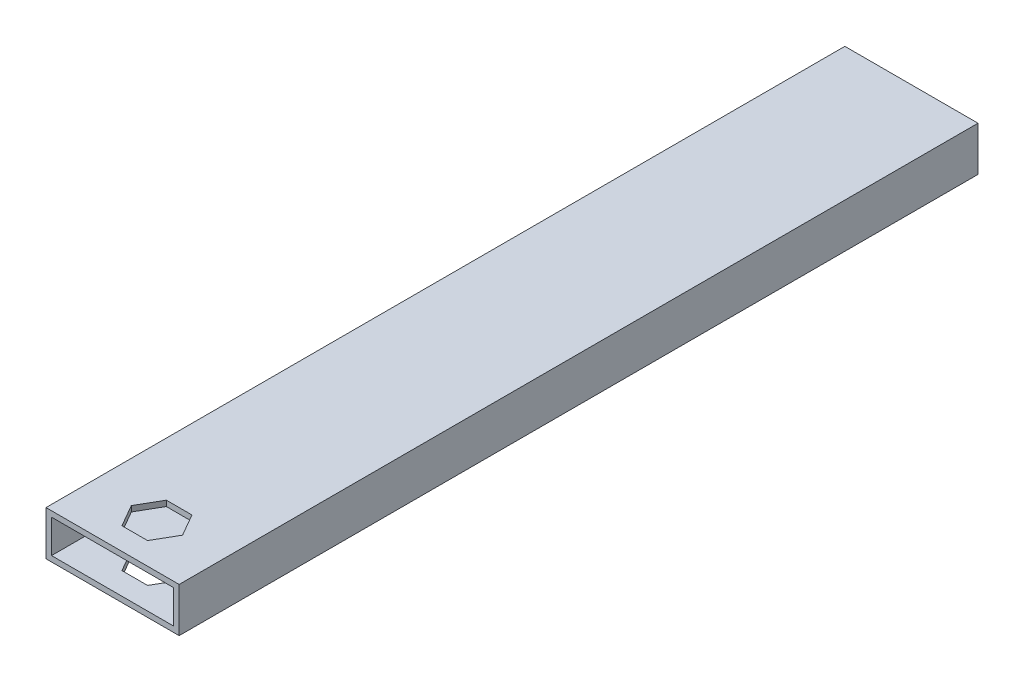
ISO-10303-21;
HEADER;
FILE_DESCRIPTION(('STEP AP214'),'2;1');
FILE_NAME('part.step','',(''),(''),'','','');
FILE_SCHEMA(('AUTOMOTIVE_DESIGN { 1 0 10303 214 1 1 1 1 }'));
ENDSEC;
DATA;
#1=APPLICATION_CONTEXT('core data for automotive mechanical design processes');
#2=APPLICATION_PROTOCOL_DEFINITION('international standard','automotive_design',2000,#1);
#3=PRODUCT_CONTEXT('',#1,'mechanical');
#4=PRODUCT('Part','Part','',(#3));
#5=PRODUCT_RELATED_PRODUCT_CATEGORY('part','',(#4));
#6=PRODUCT_DEFINITION_FORMATION('','',#4);
#7=PRODUCT_DEFINITION_CONTEXT('part definition',#1,'design');
#8=PRODUCT_DEFINITION('design','',#6,#7);
#9=PRODUCT_DEFINITION_SHAPE('','',#8);
#10=(LENGTH_UNIT() NAMED_UNIT(*) SI_UNIT(.MILLI.,.METRE.));
#11=(NAMED_UNIT(*) PLANE_ANGLE_UNIT() SI_UNIT($,.RADIAN.));
#12=(NAMED_UNIT(*) SI_UNIT($,.STERADIAN.) SOLID_ANGLE_UNIT());
#13=UNCERTAINTY_MEASURE_WITH_UNIT(LENGTH_MEASURE(1.E-05),#10,'distance_accuracy_value','');
#14=(GEOMETRIC_REPRESENTATION_CONTEXT(3) GLOBAL_UNCERTAINTY_ASSIGNED_CONTEXT((#13)) GLOBAL_UNIT_ASSIGNED_CONTEXT((#10,
#11,#12)) REPRESENTATION_CONTEXT('',''));
#15=CARTESIAN_POINT('',(0.,0.,0.));
#16=DIRECTION('',(0.,0.,1.));
#17=DIRECTION('',(1.,0.,0.));
#18=AXIS2_PLACEMENT_3D('',#15,#16,#17);
#19=CARTESIAN_POINT('',(0.,0.,228.6));
#20=DIRECTION('',(1.,0.,0.));
#21=DIRECTION('',(0.,0.,-1.));
#22=AXIS2_PLACEMENT_3D('',#19,#20,#21);
#23=PLANE('',#22);
#24=DIRECTION('',(0.,-1.,0.));
#25=VECTOR('',#24,1.);
#26=CARTESIAN_POINT('',(0.,0.,0.));
#27=LINE('',#26,#25);
#28=CARTESIAN_POINT('',(0.,12.7,0.));
#29=VERTEX_POINT('',#28);
#30=CARTESIAN_POINT('',(0.,0.,0.));
#31=VERTEX_POINT('',#30);
#32=EDGE_CURVE('E278',#29,#31,#27,.T.);
#33=ORIENTED_EDGE('',*,*,#32,.T.);
#34=DIRECTION('',(0.,0.,-1.));
#35=VECTOR('',#34,1.);
#36=CARTESIAN_POINT('',(0.,0.,228.6));
#37=LINE('',#36,#35);
#38=CARTESIAN_POINT('',(0.,0.,228.6));
#39=VERTEX_POINT('',#38);
#40=EDGE_CURVE('E311',#39,#31,#37,.T.);
#41=ORIENTED_EDGE('',*,*,#40,.F.);
#42=DIRECTION('',(0.,-1.,0.));
#43=VECTOR('',#42,1.);
#44=CARTESIAN_POINT('',(0.,0.,228.6));
#45=LINE('',#44,#43);
#46=CARTESIAN_POINT('',(0.,12.7,228.6));
#47=VERTEX_POINT('',#46);
#48=EDGE_CURVE('E285',#47,#39,#45,.T.);
#49=ORIENTED_EDGE('',*,*,#48,.F.);
#50=DIRECTION('',(0.,0.,-1.));
#51=VECTOR('',#50,1.);
#52=CARTESIAN_POINT('',(0.,12.7,228.6));
#53=LINE('',#52,#51);
#54=EDGE_CURVE('E295',#47,#29,#53,.T.);
#55=ORIENTED_EDGE('',*,*,#54,.T.);
#56=EDGE_LOOP('',(#33,#41,#49,#55));
#57=FACE_BOUND('',#56,.T.);
#58=ADVANCED_FACE('F33',(#57),#23,.F.);
#59=CARTESIAN_POINT('',(0.,0.,228.6));
#60=DIRECTION('',(0.,1.,0.));
#61=DIRECTION('',(0.,0.,1.));
#62=AXIS2_PLACEMENT_3D('',#59,#60,#61);
#63=PLANE('',#62);
#64=DIRECTION('',(-0.5,0.,0.866025403784439));
#65=VECTOR('',#64,1.);
#66=CARTESIAN_POINT('',(26.3823484187083,0.,215.9));
#67=LINE('',#66,#65);
#68=CARTESIAN_POINT('',(26.3823484187083,0.,215.9));
#69=VERTEX_POINT('',#68);
#70=CARTESIAN_POINT('',(22.7161742093541,0.,222.25));
#71=VERTEX_POINT('',#70);
#72=EDGE_CURVE('E210',#69,#71,#67,.T.);
#73=ORIENTED_EDGE('',*,*,#72,.F.);
#74=DIRECTION('',(0.499999999999999,0.,0.866025403784439));
#75=VECTOR('',#74,1.);
#76=CARTESIAN_POINT('',(22.7161742093542,0.,209.55));
#77=LINE('',#76,#75);
#78=CARTESIAN_POINT('',(22.7161742093542,0.,209.55));
#79=VERTEX_POINT('',#78);
#80=EDGE_CURVE('E47',#79,#69,#77,.T.);
#81=ORIENTED_EDGE('',*,*,#80,.F.);
#82=DIRECTION('',(1.,0.,0.));
#83=VECTOR('',#82,1.);
#84=CARTESIAN_POINT('',(15.3838257906459,0.,209.55));
#85=LINE('',#84,#83);
#86=CARTESIAN_POINT('',(15.3838257906459,0.,209.55));
#87=VERTEX_POINT('',#86);
#88=EDGE_CURVE('E196',#87,#79,#85,.T.);
#89=ORIENTED_EDGE('',*,*,#88,.F.);
#90=DIRECTION('',(0.5,0.,-0.866025403784439));
#91=VECTOR('',#90,1.);
#92=CARTESIAN_POINT('',(11.7176515812918,0.,215.9));
#93=LINE('',#92,#91);
#94=CARTESIAN_POINT('',(11.7176515812918,0.,215.9));
#95=VERTEX_POINT('',#94);
#96=EDGE_CURVE('E199',#95,#87,#93,.T.);
#97=ORIENTED_EDGE('',*,*,#96,.F.);
#98=DIRECTION('',(-0.5,0.,-0.866025403784439));
#99=VECTOR('',#98,1.);
#100=CARTESIAN_POINT('',(15.3838257906459,0.,222.25));
#101=LINE('',#100,#99);
#102=CARTESIAN_POINT('',(15.3838257906459,0.,222.25));
#103=VERTEX_POINT('',#102);
#104=EDGE_CURVE('E216',#103,#95,#101,.T.);
#105=ORIENTED_EDGE('',*,*,#104,.F.);
#106=DIRECTION('',(-1.,0.,0.));
#107=VECTOR('',#106,1.);
#108=CARTESIAN_POINT('',(22.7161742093541,0.,222.25));
#109=LINE('',#108,#107);
#110=EDGE_CURVE('E213',#71,#103,#109,.T.);
#111=ORIENTED_EDGE('',*,*,#110,.F.);
#112=EDGE_LOOP('',(#73,#81,#89,#97,#105,#111));
#113=FACE_BOUND('',#112,.T.);
#114=DIRECTION('',(1.,0.,0.));
#115=VECTOR('',#114,1.);
#116=CARTESIAN_POINT('',(0.,0.,0.));
#117=LINE('',#116,#115);
#118=CARTESIAN_POINT('',(38.1,0.,0.));
#119=VERTEX_POINT('',#118);
#120=EDGE_CURVE('E298',#31,#119,#117,.T.);
#121=ORIENTED_EDGE('',*,*,#120,.T.);
#122=DIRECTION('',(0.,0.,-1.));
#123=VECTOR('',#122,1.);
#124=CARTESIAN_POINT('',(38.1,0.,228.6));
#125=LINE('',#124,#123);
#126=CARTESIAN_POINT('',(38.1,0.,228.6));
#127=VERTEX_POINT('',#126);
#128=EDGE_CURVE('E308',#127,#119,#125,.T.);
#129=ORIENTED_EDGE('',*,*,#128,.F.);
#130=DIRECTION('',(1.,0.,0.));
#131=VECTOR('',#130,1.);
#132=CARTESIAN_POINT('',(0.,0.,228.6));
#133=LINE('',#132,#131);
#134=EDGE_CURVE('E288',#39,#127,#133,.T.);
#135=ORIENTED_EDGE('',*,*,#134,.F.);
#136=ORIENTED_EDGE('',*,*,#40,.T.);
#137=EDGE_LOOP('',(#121,#129,#135,#136));
#138=FACE_BOUND('',#137,.T.);
#139=ADVANCED_FACE('F341',(#113,#138),#63,.F.);
#140=CARTESIAN_POINT('',(38.1,0.,228.6));
#141=DIRECTION('',(-1.,0.,0.));
#142=DIRECTION('',(0.,0.,1.));
#143=AXIS2_PLACEMENT_3D('',#140,#141,#142);
#144=PLANE('',#143);
#145=DIRECTION('',(0.,1.,0.));
#146=VECTOR('',#145,1.);
#147=CARTESIAN_POINT('',(38.1,0.,0.));
#148=LINE('',#147,#146);
#149=CARTESIAN_POINT('',(38.1,12.7,0.));
#150=VERTEX_POINT('',#149);
#151=EDGE_CURVE('E300',#119,#150,#148,.T.);
#152=ORIENTED_EDGE('',*,*,#151,.T.);
#153=DIRECTION('',(0.,0.,-1.));
#154=VECTOR('',#153,1.);
#155=CARTESIAN_POINT('',(38.1,12.7,228.6));
#156=LINE('',#155,#154);
#157=CARTESIAN_POINT('',(38.1,12.7,228.6));
#158=VERTEX_POINT('',#157);
#159=EDGE_CURVE('E305',#158,#150,#156,.T.);
#160=ORIENTED_EDGE('',*,*,#159,.F.);
#161=DIRECTION('',(0.,1.,0.));
#162=VECTOR('',#161,1.);
#163=CARTESIAN_POINT('',(38.1,0.,228.6));
#164=LINE('',#163,#162);
#165=EDGE_CURVE('E291',#127,#158,#164,.T.);
#166=ORIENTED_EDGE('',*,*,#165,.F.);
#167=ORIENTED_EDGE('',*,*,#128,.T.);
#168=EDGE_LOOP('',(#152,#160,#166,#167));
#169=FACE_BOUND('',#168,.T.);
#170=ADVANCED_FACE('F363',(#169),#144,.F.);
#171=CARTESIAN_POINT('',(0.,12.7,228.6));
#172=DIRECTION('',(0.,-1.,0.));
#173=DIRECTION('',(0.,0.,-1.));
#174=AXIS2_PLACEMENT_3D('',#171,#172,#173);
#175=PLANE('',#174);
#176=DIRECTION('',(1.,0.,0.));
#177=VECTOR('',#176,1.);
#178=CARTESIAN_POINT('',(15.3838257906459,12.7,209.55));
#179=LINE('',#178,#177);
#180=CARTESIAN_POINT('',(15.3838257906459,12.7,209.55));
#181=VERTEX_POINT('',#180);
#182=CARTESIAN_POINT('',(22.7161742093542,12.7,209.55));
#183=VERTEX_POINT('',#182);
#184=EDGE_CURVE('E195',#181,#183,#179,.T.);
#185=ORIENTED_EDGE('',*,*,#184,.T.);
#186=DIRECTION('',(0.499999999999999,0.,0.866025403784439));
#187=VECTOR('',#186,1.);
#188=CARTESIAN_POINT('',(22.7161742093542,12.7,209.55));
#189=LINE('',#188,#187);
#190=CARTESIAN_POINT('',(26.3823484187083,12.7,215.9));
#191=VERTEX_POINT('',#190);
#192=EDGE_CURVE('E176',#183,#191,#189,.T.);
#193=ORIENTED_EDGE('',*,*,#192,.T.);
#194=DIRECTION('',(-0.5,0.,0.866025403784439));
#195=VECTOR('',#194,1.);
#196=CARTESIAN_POINT('',(26.3823484187083,12.7,215.9));
#197=LINE('',#196,#195);
#198=CARTESIAN_POINT('',(22.7161742093541,12.7,222.25));
#199=VERTEX_POINT('',#198);
#200=EDGE_CURVE('E186',#191,#199,#197,.T.);
#201=ORIENTED_EDGE('',*,*,#200,.T.);
#202=DIRECTION('',(-1.,0.,0.));
#203=VECTOR('',#202,1.);
#204=CARTESIAN_POINT('',(22.7161742093541,12.7,222.25));
#205=LINE('',#204,#203);
#206=CARTESIAN_POINT('',(15.3838257906459,12.7,222.25));
#207=VERTEX_POINT('',#206);
#208=EDGE_CURVE('E55',#199,#207,#205,.T.);
#209=ORIENTED_EDGE('',*,*,#208,.T.);
#210=DIRECTION('',(-0.5,0.,-0.866025403784439));
#211=VECTOR('',#210,1.);
#212=CARTESIAN_POINT('',(15.3838257906459,12.7,222.25));
#213=LINE('',#212,#211);
#214=CARTESIAN_POINT('',(11.7176515812918,12.7,215.9));
#215=VERTEX_POINT('',#214);
#216=EDGE_CURVE('E203',#207,#215,#213,.T.);
#217=ORIENTED_EDGE('',*,*,#216,.T.);
#218=DIRECTION('',(0.5,0.,-0.866025403784439));
#219=VECTOR('',#218,1.);
#220=CARTESIAN_POINT('',(11.7176515812918,12.7,215.9));
#221=LINE('',#220,#219);
#222=EDGE_CURVE('E206',#215,#181,#221,.T.);
#223=ORIENTED_EDGE('',*,*,#222,.T.);
#224=EDGE_LOOP('',(#185,#193,#201,#209,#217,#223));
#225=FACE_BOUND('',#224,.T.);
#226=DIRECTION('',(-1.,0.,0.));
#227=VECTOR('',#226,1.);
#228=CARTESIAN_POINT('',(0.,12.7,0.));
#229=LINE('',#228,#227);
#230=EDGE_CURVE('E289',#150,#29,#229,.T.);
#231=ORIENTED_EDGE('',*,*,#230,.T.);
#232=ORIENTED_EDGE('',*,*,#54,.F.);
#233=DIRECTION('',(-1.,0.,0.));
#234=VECTOR('',#233,1.);
#235=CARTESIAN_POINT('',(0.,12.7,228.6));
#236=LINE('',#235,#234);
#237=EDGE_CURVE('E293',#158,#47,#236,.T.);
#238=ORIENTED_EDGE('',*,*,#237,.F.);
#239=ORIENTED_EDGE('',*,*,#159,.T.);
#240=EDGE_LOOP('',(#231,#232,#238,#239));
#241=FACE_BOUND('',#240,.T.);
#242=ADVANCED_FACE('F191',(#225,#241),#175,.F.);
#243=CARTESIAN_POINT('',(0.,0.,228.6));
#244=DIRECTION('',(0.,0.,-1.));
#245=DIRECTION('',(-1.,0.,0.));
#246=AXIS2_PLACEMENT_3D('',#243,#244,#245);
#247=PLANE('',#246);
#248=DIRECTION('',(0.,-1.,0.));
#249=VECTOR('',#248,1.);
#250=CARTESIAN_POINT('',(1.5875,11.1125,228.6));
#251=LINE('',#250,#249);
#252=CARTESIAN_POINT('',(1.5875,11.1125,228.6));
#253=VERTEX_POINT('',#252);
#254=CARTESIAN_POINT('',(1.5875,1.5875,228.6));
#255=VERTEX_POINT('',#254);
#256=EDGE_CURVE('E268',#253,#255,#251,.T.);
#257=ORIENTED_EDGE('',*,*,#256,.F.);
#258=DIRECTION('',(-1.,0.,0.));
#259=VECTOR('',#258,1.);
#260=CARTESIAN_POINT('',(36.5125,11.1125,228.6));
#261=LINE('',#260,#259);
#262=CARTESIAN_POINT('',(36.5125,11.1125,228.6));
#263=VERTEX_POINT('',#262);
#264=EDGE_CURVE('E252',#263,#253,#261,.T.);
#265=ORIENTED_EDGE('',*,*,#264,.F.);
#266=DIRECTION('',(0.,1.,0.));
#267=VECTOR('',#266,1.);
#268=CARTESIAN_POINT('',(36.5125,1.5875,228.6));
#269=LINE('',#268,#267);
#270=CARTESIAN_POINT('',(36.5125,1.5875,228.6));
#271=VERTEX_POINT('',#270);
#272=EDGE_CURVE('E257',#271,#263,#269,.T.);
#273=ORIENTED_EDGE('',*,*,#272,.F.);
#274=DIRECTION('',(1.,0.,0.));
#275=VECTOR('',#274,1.);
#276=CARTESIAN_POINT('',(1.5875,1.5875,228.6));
#277=LINE('',#276,#275);
#278=EDGE_CURVE('E271',#255,#271,#277,.T.);
#279=ORIENTED_EDGE('',*,*,#278,.F.);
#280=EDGE_LOOP('',(#257,#265,#273,#279));
#281=FACE_BOUND('',#280,.T.);
#282=ORIENTED_EDGE('',*,*,#48,.T.);
#283=ORIENTED_EDGE('',*,*,#134,.T.);
#284=ORIENTED_EDGE('',*,*,#165,.T.);
#285=ORIENTED_EDGE('',*,*,#237,.T.);
#286=EDGE_LOOP('',(#282,#283,#284,#285));
#287=FACE_BOUND('',#286,.T.);
#288=ADVANCED_FACE('F375',(#281,#287),#247,.F.);
#289=CARTESIAN_POINT('',(0.,0.,0.));
#290=DIRECTION('',(0.,0.,-1.));
#291=DIRECTION('',(-1.,0.,0.));
#292=AXIS2_PLACEMENT_3D('',#289,#290,#291);
#293=PLANE('',#292);
#294=DIRECTION('',(-1.,0.,0.));
#295=VECTOR('',#294,1.);
#296=CARTESIAN_POINT('',(36.5125,11.1125,0.));
#297=LINE('',#296,#295);
#298=CARTESIAN_POINT('',(36.5125,11.1125,0.));
#299=VERTEX_POINT('',#298);
#300=CARTESIAN_POINT('',(1.5875,11.1125,0.));
#301=VERTEX_POINT('',#300);
#302=EDGE_CURVE('E253',#299,#301,#297,.T.);
#303=ORIENTED_EDGE('',*,*,#302,.T.);
#304=DIRECTION('',(0.,-1.,0.));
#305=VECTOR('',#304,1.);
#306=CARTESIAN_POINT('',(1.5875,11.1125,0.));
#307=LINE('',#306,#305);
#308=CARTESIAN_POINT('',(1.5875,1.5875,0.));
#309=VERTEX_POINT('',#308);
#310=EDGE_CURVE('E256',#301,#309,#307,.T.);
#311=ORIENTED_EDGE('',*,*,#310,.T.);
#312=DIRECTION('',(1.,0.,0.));
#313=VECTOR('',#312,1.);
#314=CARTESIAN_POINT('',(1.5875,1.5875,0.));
#315=LINE('',#314,#313);
#316=CARTESIAN_POINT('',(36.5125,1.5875,0.));
#317=VERTEX_POINT('',#316);
#318=EDGE_CURVE('E260',#309,#317,#315,.T.);
#319=ORIENTED_EDGE('',*,*,#318,.T.);
#320=DIRECTION('',(0.,1.,0.));
#321=VECTOR('',#320,1.);
#322=CARTESIAN_POINT('',(36.5125,1.5875,0.));
#323=LINE('',#322,#321);
#324=EDGE_CURVE('E263',#317,#299,#323,.T.);
#325=ORIENTED_EDGE('',*,*,#324,.T.);
#326=EDGE_LOOP('',(#303,#311,#319,#325));
#327=FACE_BOUND('',#326,.T.);
#328=ORIENTED_EDGE('',*,*,#32,.F.);
#329=ORIENTED_EDGE('',*,*,#230,.F.);
#330=ORIENTED_EDGE('',*,*,#151,.F.);
#331=ORIENTED_EDGE('',*,*,#120,.F.);
#332=EDGE_LOOP('',(#328,#329,#330,#331));
#333=FACE_BOUND('',#332,.T.);
#334=ADVANCED_FACE('F370',(#327,#333),#293,.T.);
#335=CARTESIAN_POINT('',(36.5125,11.1125,0.));
#336=DIRECTION('',(0.,1.,0.));
#337=DIRECTION('',(0.,0.,1.));
#338=AXIS2_PLACEMENT_3D('',#335,#336,#337);
#339=PLANE('',#338);
#340=DIRECTION('',(0.5,0.,-0.866025403784439));
#341=VECTOR('',#340,1.);
#342=CARTESIAN_POINT('',(122.402328652561,11.1125,49.5885156932071));
#343=LINE('',#342,#341);
#344=CARTESIAN_POINT('',(22.7161742093541,11.1125,222.25));
#345=VERTEX_POINT('',#344);
#346=CARTESIAN_POINT('',(26.3823484187082,11.1125,215.9));
#347=VERTEX_POINT('',#346);
#348=EDGE_CURVE('E223',#345,#347,#343,.T.);
#349=ORIENTED_EDGE('',*,*,#348,.T.);
#350=DIRECTION('',(-0.5,0.,-0.866025403784439));
#351=VECTOR('',#350,1.);
#352=CARTESIAN_POINT('',(-64.5725560244989,11.1125,58.3614843067928));
#353=LINE('',#352,#351);
#354=CARTESIAN_POINT('',(22.7161742093542,11.1125,209.55));
#355=VERTEX_POINT('',#354);
#356=EDGE_CURVE('E179',#347,#355,#353,.T.);
#357=ORIENTED_EDGE('',*,*,#356,.T.);
#358=DIRECTION('',(-1.,0.,0.));
#359=VECTOR('',#358,1.);
#360=CARTESIAN_POINT('',(36.5125,11.1125,209.55));
#361=LINE('',#360,#359);
#362=CARTESIAN_POINT('',(15.3838257906459,11.1125,209.55));
#363=VERTEX_POINT('',#362);
#364=EDGE_CURVE('E248',#355,#363,#361,.T.);
#365=ORIENTED_EDGE('',*,*,#364,.T.);
#366=DIRECTION('',(-0.5,0.,0.866025403784439));
#367=VECTOR('',#366,1.);
#368=CARTESIAN_POINT('',(111.403806024499,11.1125,43.2385156932072));
#369=LINE('',#368,#367);
#370=CARTESIAN_POINT('',(11.7176515812918,11.1125,215.9));
#371=VERTEX_POINT('',#370);
#372=EDGE_CURVE('E245',#363,#371,#369,.T.);
#373=ORIENTED_EDGE('',*,*,#372,.T.);
#374=DIRECTION('',(0.5,0.,0.866025403784439));
#375=VECTOR('',#374,1.);
#376=CARTESIAN_POINT('',(-75.5710786525613,11.1125,64.7114843067928));
#377=LINE('',#376,#375);
#378=CARTESIAN_POINT('',(15.3838257906459,11.1125,222.25));
#379=VERTEX_POINT('',#378);
#380=EDGE_CURVE('E242',#371,#379,#377,.T.);
#381=ORIENTED_EDGE('',*,*,#380,.T.);
#382=DIRECTION('',(1.,0.,0.));
#383=VECTOR('',#382,1.);
#384=CARTESIAN_POINT('',(36.5125,11.1125,222.25));
#385=LINE('',#384,#383);
#386=EDGE_CURVE('E239',#379,#345,#385,.T.);
#387=ORIENTED_EDGE('',*,*,#386,.T.);
#388=EDGE_LOOP('',(#349,#357,#365,#373,#381,#387));
#389=FACE_BOUND('',#388,.T.);
#390=ORIENTED_EDGE('',*,*,#264,.T.);
#391=DIRECTION('',(0.,0.,1.));
#392=VECTOR('',#391,1.);
#393=CARTESIAN_POINT('',(1.5875,11.1125,0.));
#394=LINE('',#393,#392);
#395=EDGE_CURVE('E266',#301,#253,#394,.T.);
#396=ORIENTED_EDGE('',*,*,#395,.F.);
#397=ORIENTED_EDGE('',*,*,#302,.F.);
#398=DIRECTION('',(0.,0.,1.));
#399=VECTOR('',#398,1.);
#400=CARTESIAN_POINT('',(36.5125,11.1125,0.));
#401=LINE('',#400,#399);
#402=EDGE_CURVE('E276',#299,#263,#401,.T.);
#403=ORIENTED_EDGE('',*,*,#402,.T.);
#404=EDGE_LOOP('',(#390,#396,#397,#403));
#405=FACE_BOUND('',#404,.T.);
#406=ADVANCED_FACE('F388',(#389,#405),#339,.F.);
#407=CARTESIAN_POINT('',(36.5125,1.5875,0.));
#408=DIRECTION('',(1.,0.,0.));
#409=DIRECTION('',(0.,0.,-1.));
#410=AXIS2_PLACEMENT_3D('',#407,#408,#409);
#411=PLANE('',#410);
#412=ORIENTED_EDGE('',*,*,#272,.T.);
#413=ORIENTED_EDGE('',*,*,#402,.F.);
#414=ORIENTED_EDGE('',*,*,#324,.F.);
#415=DIRECTION('',(0.,0.,1.));
#416=VECTOR('',#415,1.);
#417=CARTESIAN_POINT('',(36.5125,1.5875,0.));
#418=LINE('',#417,#416);
#419=EDGE_CURVE('E279',#317,#271,#418,.T.);
#420=ORIENTED_EDGE('',*,*,#419,.T.);
#421=EDGE_LOOP('',(#412,#413,#414,#420));
#422=FACE_BOUND('',#421,.T.);
#423=ADVANCED_FACE('F395',(#422),#411,.F.);
#424=CARTESIAN_POINT('',(1.5875,1.5875,0.));
#425=DIRECTION('',(0.,-1.,0.));
#426=DIRECTION('',(0.,0.,-1.));
#427=AXIS2_PLACEMENT_3D('',#424,#425,#426);
#428=PLANE('',#427);
#429=DIRECTION('',(1.,0.,0.));
#430=VECTOR('',#429,1.);
#431=CARTESIAN_POINT('',(1.5875,1.5875,209.55));
#432=LINE('',#431,#430);
#433=CARTESIAN_POINT('',(15.3838257906459,1.5875,209.55));
#434=VERTEX_POINT('',#433);
#435=CARTESIAN_POINT('',(22.7161742093542,1.5875,209.55));
#436=VERTEX_POINT('',#435);
#437=EDGE_CURVE('E40',#434,#436,#432,.T.);
#438=ORIENTED_EDGE('',*,*,#437,.T.);
#439=DIRECTION('',(0.5,0.,0.866025403784439));
#440=VECTOR('',#439,1.);
#441=CARTESIAN_POINT('',(-73.3038060244989,1.5875,43.238515693207));
#442=LINE('',#441,#440);
#443=CARTESIAN_POINT('',(26.3823484187083,1.5875,215.9));
#444=VERTEX_POINT('',#443);
#445=EDGE_CURVE('E11',#436,#444,#442,.T.);
#446=ORIENTED_EDGE('',*,*,#445,.T.);
#447=DIRECTION('',(-0.5,0.,0.866025403784439));
#448=VECTOR('',#447,1.);
#449=CARTESIAN_POINT('',(113.671078652561,1.5875,64.7114843067928));
#450=LINE('',#449,#448);
#451=CARTESIAN_POINT('',(22.7161742093541,1.5875,222.25));
#452=VERTEX_POINT('',#451);
#453=EDGE_CURVE('E314',#444,#452,#450,.T.);
#454=ORIENTED_EDGE('',*,*,#453,.T.);
#455=DIRECTION('',(-1.,0.,0.));
#456=VECTOR('',#455,1.);
#457=CARTESIAN_POINT('',(1.5875,1.5875,222.25));
#458=LINE('',#457,#456);
#459=CARTESIAN_POINT('',(15.3838257906459,1.5875,222.25));
#460=VERTEX_POINT('',#459);
#461=EDGE_CURVE('E317',#452,#460,#458,.T.);
#462=ORIENTED_EDGE('',*,*,#461,.T.);
#463=DIRECTION('',(-0.5,0.,-0.866025403784439));
#464=VECTOR('',#463,1.);
#465=CARTESIAN_POINT('',(-84.3023286525613,1.5875,49.5885156932071));
#466=LINE('',#465,#464);
#467=CARTESIAN_POINT('',(11.7176515812918,1.5875,215.9));
#468=VERTEX_POINT('',#467);
#469=EDGE_CURVE('E320',#460,#468,#466,.T.);
#470=ORIENTED_EDGE('',*,*,#469,.T.);
#471=DIRECTION('',(0.5,0.,-0.866025403784439));
#472=VECTOR('',#471,1.);
#473=CARTESIAN_POINT('',(102.672556024499,1.5875,58.3614843067929));
#474=LINE('',#473,#472);
#475=EDGE_CURVE('E323',#468,#434,#474,.T.);
#476=ORIENTED_EDGE('',*,*,#475,.T.);
#477=EDGE_LOOP('',(#438,#446,#454,#462,#470,#476));
#478=FACE_BOUND('',#477,.T.);
#479=ORIENTED_EDGE('',*,*,#278,.T.);
#480=ORIENTED_EDGE('',*,*,#419,.F.);
#481=ORIENTED_EDGE('',*,*,#318,.F.);
#482=DIRECTION('',(0.,0.,1.));
#483=VECTOR('',#482,1.);
#484=CARTESIAN_POINT('',(1.5875,1.5875,0.));
#485=LINE('',#484,#483);
#486=EDGE_CURVE('E281',#309,#255,#485,.T.);
#487=ORIENTED_EDGE('',*,*,#486,.T.);
#488=EDGE_LOOP('',(#479,#480,#481,#487));
#489=FACE_BOUND('',#488,.T.);
#490=ADVANCED_FACE('F327',(#478,#489),#428,.F.);
#491=CARTESIAN_POINT('',(1.5875,11.1125,0.));
#492=DIRECTION('',(-1.,0.,0.));
#493=DIRECTION('',(0.,0.,1.));
#494=AXIS2_PLACEMENT_3D('',#491,#492,#493);
#495=PLANE('',#494);
#496=ORIENTED_EDGE('',*,*,#256,.T.);
#497=ORIENTED_EDGE('',*,*,#486,.F.);
#498=ORIENTED_EDGE('',*,*,#310,.F.);
#499=ORIENTED_EDGE('',*,*,#395,.T.);
#500=EDGE_LOOP('',(#496,#497,#498,#499));
#501=FACE_BOUND('',#500,.T.);
#502=ADVANCED_FACE('F397',(#501),#495,.F.);
#503=CARTESIAN_POINT('',(26.3823484187083,12.7,215.9));
#504=DIRECTION('',(0.866025403784439,0.,0.5));
#505=DIRECTION('',(0.5,0.,-0.866025403784439));
#506=AXIS2_PLACEMENT_3D('',#503,#504,#505);
#507=PLANE('',#506);
#508=DIRECTION('',(0.,-1.,0.));
#509=VECTOR('',#508,1.);
#510=CARTESIAN_POINT('',(26.3823484187083,12.7,215.9));
#511=LINE('',#510,#509);
#512=EDGE_CURVE('E183',#444,#69,#511,.T.);
#513=ORIENTED_EDGE('',*,*,#512,.T.);
#514=ORIENTED_EDGE('',*,*,#72,.T.);
#515=DIRECTION('',(0.,-1.,0.));
#516=VECTOR('',#515,1.);
#517=CARTESIAN_POINT('',(22.7161742093541,12.7,222.25));
#518=LINE('',#517,#516);
#519=EDGE_CURVE('E182',#452,#71,#518,.T.);
#520=ORIENTED_EDGE('',*,*,#519,.F.);
#521=ORIENTED_EDGE('',*,*,#453,.F.);
#522=EDGE_LOOP('',(#513,#514,#520,#521));
#523=FACE_BOUND('',#522,.T.);
#524=ADVANCED_FACE('F345',(#523),#507,.F.);
#525=CARTESIAN_POINT('',(22.7161742093541,12.7,222.25));
#526=DIRECTION('',(0.,0.,1.));
#527=DIRECTION('',(1.,0.,0.));
#528=AXIS2_PLACEMENT_3D('',#525,#526,#527);
#529=PLANE('',#528);
#530=ORIENTED_EDGE('',*,*,#519,.T.);
#531=ORIENTED_EDGE('',*,*,#110,.T.);
#532=DIRECTION('',(0.,-1.,0.));
#533=VECTOR('',#532,1.);
#534=CARTESIAN_POINT('',(15.3838257906459,12.7,222.25));
#535=LINE('',#534,#533);
#536=EDGE_CURVE('E236',#460,#103,#535,.T.);
#537=ORIENTED_EDGE('',*,*,#536,.F.);
#538=ORIENTED_EDGE('',*,*,#461,.F.);
#539=EDGE_LOOP('',(#530,#531,#537,#538));
#540=FACE_BOUND('',#539,.T.);
#541=ADVANCED_FACE('F433',(#540),#529,.F.);
#542=CARTESIAN_POINT('',(15.3838257906459,12.7,222.25));
#543=DIRECTION('',(-0.866025403784439,0.,0.5));
#544=DIRECTION('',(0.5,0.,0.866025403784439));
#545=AXIS2_PLACEMENT_3D('',#542,#543,#544);
#546=PLANE('',#545);
#547=ORIENTED_EDGE('',*,*,#536,.T.);
#548=ORIENTED_EDGE('',*,*,#104,.T.);
#549=DIRECTION('',(0.,-1.,0.));
#550=VECTOR('',#549,1.);
#551=CARTESIAN_POINT('',(11.7176515812918,12.7,215.9));
#552=LINE('',#551,#550);
#553=EDGE_CURVE('E232',#468,#95,#552,.T.);
#554=ORIENTED_EDGE('',*,*,#553,.F.);
#555=ORIENTED_EDGE('',*,*,#469,.F.);
#556=EDGE_LOOP('',(#547,#548,#554,#555));
#557=FACE_BOUND('',#556,.T.);
#558=ADVANCED_FACE('F439',(#557),#546,.F.);
#559=CARTESIAN_POINT('',(11.7176515812918,12.7,215.9));
#560=DIRECTION('',(-0.866025403784438,0.,-0.5));
#561=DIRECTION('',(-0.5,0.,0.866025403784439));
#562=AXIS2_PLACEMENT_3D('',#559,#560,#561);
#563=PLANE('',#562);
#564=ORIENTED_EDGE('',*,*,#553,.T.);
#565=ORIENTED_EDGE('',*,*,#96,.T.);
#566=DIRECTION('',(0.,-1.,0.));
#567=VECTOR('',#566,1.);
#568=CARTESIAN_POINT('',(15.3838257906459,12.7,209.55));
#569=LINE('',#568,#567);
#570=EDGE_CURVE('E228',#434,#87,#569,.T.);
#571=ORIENTED_EDGE('',*,*,#570,.F.);
#572=ORIENTED_EDGE('',*,*,#475,.F.);
#573=EDGE_LOOP('',(#564,#565,#571,#572));
#574=FACE_BOUND('',#573,.T.);
#575=ADVANCED_FACE('F334',(#574),#563,.F.);
#576=CARTESIAN_POINT('',(15.3838257906459,12.7,209.55));
#577=DIRECTION('',(0.,0.,-1.));
#578=DIRECTION('',(-1.,0.,0.));
#579=AXIS2_PLACEMENT_3D('',#576,#577,#578);
#580=PLANE('',#579);
#581=ORIENTED_EDGE('',*,*,#570,.T.);
#582=ORIENTED_EDGE('',*,*,#88,.T.);
#583=DIRECTION('',(0.,-1.,0.));
#584=VECTOR('',#583,1.);
#585=CARTESIAN_POINT('',(22.7161742093542,12.7,209.55));
#586=LINE('',#585,#584);
#587=EDGE_CURVE('E224',#436,#79,#586,.T.);
#588=ORIENTED_EDGE('',*,*,#587,.F.);
#589=ORIENTED_EDGE('',*,*,#437,.F.);
#590=EDGE_LOOP('',(#581,#582,#588,#589));
#591=FACE_BOUND('',#590,.T.);
#592=ADVANCED_FACE('F332',(#591),#580,.F.);
#593=CARTESIAN_POINT('',(22.7161742093542,12.7,209.55));
#594=DIRECTION('',(0.866025403784439,0.,-0.499999999999999));
#595=DIRECTION('',(-0.5,0.,-0.866025403784439));
#596=AXIS2_PLACEMENT_3D('',#593,#594,#595);
#597=PLANE('',#596);
#598=ORIENTED_EDGE('',*,*,#587,.T.);
#599=ORIENTED_EDGE('',*,*,#80,.T.);
#600=ORIENTED_EDGE('',*,*,#512,.F.);
#601=ORIENTED_EDGE('',*,*,#445,.F.);
#602=EDGE_LOOP('',(#598,#599,#600,#601));
#603=FACE_BOUND('',#602,.T.);
#604=ADVANCED_FACE('F347',(#603),#597,.F.);
#605=EDGE_CURVE('E171',#191,#347,#511,.T.);
#606=ORIENTED_EDGE('',*,*,#605,.F.);
#607=ORIENTED_EDGE('',*,*,#192,.F.);
#608=EDGE_CURVE('E221',#183,#355,#586,.T.);
#609=ORIENTED_EDGE('',*,*,#608,.T.);
#610=ORIENTED_EDGE('',*,*,#356,.F.);
#611=EDGE_LOOP('',(#606,#607,#609,#610));
#612=FACE_BOUND('',#611,.T.);
#613=ADVANCED_FACE('F173',(#612),#597,.F.);
#614=ORIENTED_EDGE('',*,*,#608,.F.);
#615=ORIENTED_EDGE('',*,*,#184,.F.);
#616=EDGE_CURVE('E225',#181,#363,#569,.T.);
#617=ORIENTED_EDGE('',*,*,#616,.T.);
#618=ORIENTED_EDGE('',*,*,#364,.F.);
#619=EDGE_LOOP('',(#614,#615,#617,#618));
#620=FACE_BOUND('',#619,.T.);
#621=ADVANCED_FACE('F354',(#620),#580,.F.);
#622=ORIENTED_EDGE('',*,*,#616,.F.);
#623=ORIENTED_EDGE('',*,*,#222,.F.);
#624=EDGE_CURVE('E229',#215,#371,#552,.T.);
#625=ORIENTED_EDGE('',*,*,#624,.T.);
#626=ORIENTED_EDGE('',*,*,#372,.F.);
#627=EDGE_LOOP('',(#622,#623,#625,#626));
#628=FACE_BOUND('',#627,.T.);
#629=ADVANCED_FACE('F456',(#628),#563,.F.);
#630=ORIENTED_EDGE('',*,*,#624,.F.);
#631=ORIENTED_EDGE('',*,*,#216,.F.);
#632=EDGE_CURVE('E233',#207,#379,#535,.T.);
#633=ORIENTED_EDGE('',*,*,#632,.T.);
#634=ORIENTED_EDGE('',*,*,#380,.F.);
#635=EDGE_LOOP('',(#630,#631,#633,#634));
#636=FACE_BOUND('',#635,.T.);
#637=ADVANCED_FACE('F450',(#636),#546,.F.);
#638=ORIENTED_EDGE('',*,*,#632,.F.);
#639=ORIENTED_EDGE('',*,*,#208,.F.);
#640=EDGE_CURVE('E188',#199,#345,#518,.T.);
#641=ORIENTED_EDGE('',*,*,#640,.T.);
#642=ORIENTED_EDGE('',*,*,#386,.F.);
#643=EDGE_LOOP('',(#638,#639,#641,#642));
#644=FACE_BOUND('',#643,.T.);
#645=ADVANCED_FACE('F442',(#644),#529,.F.);
#646=ORIENTED_EDGE('',*,*,#640,.F.);
#647=ORIENTED_EDGE('',*,*,#200,.F.);
#648=ORIENTED_EDGE('',*,*,#605,.T.);
#649=ORIENTED_EDGE('',*,*,#348,.F.);
#650=EDGE_LOOP('',(#646,#647,#648,#649));
#651=FACE_BOUND('',#650,.T.);
#652=ADVANCED_FACE('F187',(#651),#507,.F.);
#653=CLOSED_SHELL('',(#58,#139,#170,#242,#288,#334,#406,#423,#490,#502,#524,#541,#558,#575,#592,
#604,#613,#621,#629,#637,#645,#652));
#654=MANIFOLD_SOLID_BREP('B2',#653);
#655=ADVANCED_BREP_SHAPE_REPRESENTATION('',(#18,#654),#14);
#656=SHAPE_DEFINITION_REPRESENTATION(#9,#655);
ENDSEC;
END-ISO-10303-21;
